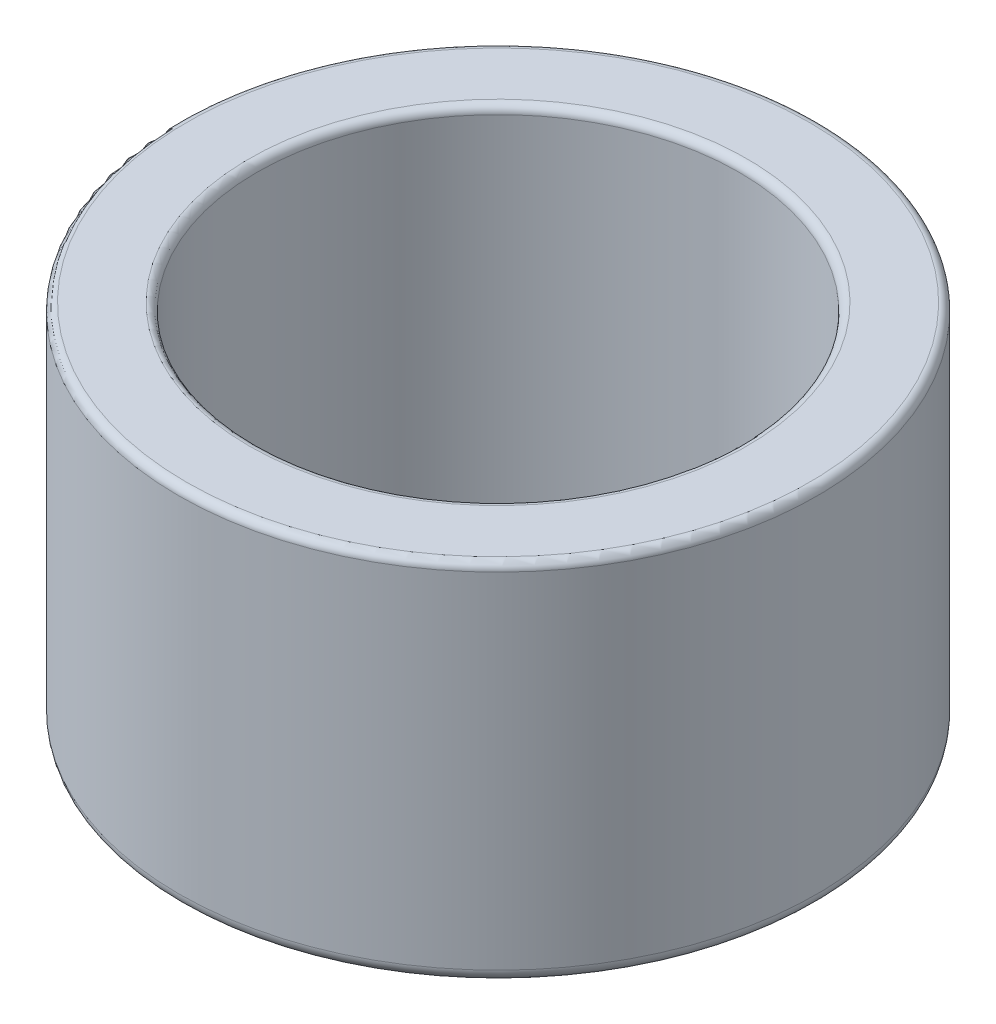
ISO-10303-21;
HEADER;
FILE_DESCRIPTION(('STEP AP214'),'2;1');
FILE_NAME('part.step','',(''),(''),'','','');
FILE_SCHEMA(('AUTOMOTIVE_DESIGN { 1 0 10303 214 1 1 1 1 }'));
ENDSEC;
DATA;
#1=APPLICATION_CONTEXT('core data for automotive mechanical design processes');
#2=APPLICATION_PROTOCOL_DEFINITION('international standard','automotive_design',2000,#1);
#3=PRODUCT_CONTEXT('',#1,'mechanical');
#4=PRODUCT('Part','Part','',(#3));
#5=PRODUCT_RELATED_PRODUCT_CATEGORY('part','',(#4));
#6=PRODUCT_DEFINITION_FORMATION('','',#4);
#7=PRODUCT_DEFINITION_CONTEXT('part definition',#1,'design');
#8=PRODUCT_DEFINITION('design','',#6,#7);
#9=PRODUCT_DEFINITION_SHAPE('','',#8);
#10=(LENGTH_UNIT() NAMED_UNIT(*) SI_UNIT(.MILLI.,.METRE.));
#11=(NAMED_UNIT(*) PLANE_ANGLE_UNIT() SI_UNIT($,.RADIAN.));
#12=(NAMED_UNIT(*) SI_UNIT($,.STERADIAN.) SOLID_ANGLE_UNIT());
#13=UNCERTAINTY_MEASURE_WITH_UNIT(LENGTH_MEASURE(1.E-05),#10,'distance_accuracy_value','');
#14=(GEOMETRIC_REPRESENTATION_CONTEXT(3) GLOBAL_UNCERTAINTY_ASSIGNED_CONTEXT((#13)) GLOBAL_UNIT_ASSIGNED_CONTEXT((#10,
#11,#12)) REPRESENTATION_CONTEXT('',''));
#15=CARTESIAN_POINT('',(0.,0.,0.));
#16=DIRECTION('',(0.,0.,1.));
#17=DIRECTION('',(1.,0.,0.));
#18=AXIS2_PLACEMENT_3D('',#15,#16,#17);
#19=CARTESIAN_POINT('',(0.,14.,0.));
#20=DIRECTION('',(0.,1.,0.));
#21=DIRECTION('',(0.,0.,1.));
#22=AXIS2_PLACEMENT_3D('',#19,#20,#21);
#23=PLANE('',#22);
#24=CARTESIAN_POINT('',(0.,14.,0.));
#25=DIRECTION('',(0.,1.,0.));
#26=DIRECTION('',(0.,0.,1.));
#27=AXIS2_PLACEMENT_3D('',#24,#25,#26);
#28=CIRCLE('',#27,9.530985);
#29=CARTESIAN_POINT('',(0.,14.,9.530985));
#30=VERTEX_POINT('',#29);
#31=EDGE_CURVE('E53',#30,#30,#28,.F.);
#32=ORIENTED_EDGE('',*,*,#31,.T.);
#33=EDGE_LOOP('',(#32));
#34=FACE_BOUND('',#33,.T.);
#35=CARTESIAN_POINT('',(0.,14.,0.));
#36=DIRECTION('',(0.,1.,0.));
#37=DIRECTION('',(0.,0.,1.));
#38=AXIS2_PLACEMENT_3D('',#35,#36,#37);
#39=CIRCLE('',#38,11.930985);
#40=CARTESIAN_POINT('',(0.,14.,11.930985));
#41=VERTEX_POINT('',#40);
#42=EDGE_CURVE('E62',#41,#41,#39,.T.);
#43=ORIENTED_EDGE('',*,*,#42,.T.);
#44=EDGE_LOOP('',(#43));
#45=FACE_BOUND('',#44,.T.);
#46=ADVANCED_FACE('F33',(#34,#45),#23,.T.);
#47=CARTESIAN_POINT('',(0.,0.,0.));
#48=DIRECTION('',(0.,1.,0.));
#49=DIRECTION('',(0.,0.,1.));
#50=AXIS2_PLACEMENT_3D('',#47,#48,#49);
#51=PLANE('',#50);
#52=CARTESIAN_POINT('',(0.,0.,0.));
#53=DIRECTION('',(0.,1.,0.));
#54=DIRECTION('',(0.,0.,1.));
#55=AXIS2_PLACEMENT_3D('',#52,#53,#54);
#56=CIRCLE('',#55,9.730985);
#57=CARTESIAN_POINT('',(0.,0.,9.730985));
#58=VERTEX_POINT('',#57);
#59=EDGE_CURVE('E40',#58,#58,#56,.T.);
#60=ORIENTED_EDGE('',*,*,#59,.T.);
#61=EDGE_LOOP('',(#60));
#62=FACE_BOUND('',#61,.T.);
#63=CARTESIAN_POINT('',(0.,0.,0.));
#64=DIRECTION('',(0.,1.,0.));
#65=DIRECTION('',(0.,0.,1.));
#66=AXIS2_PLACEMENT_3D('',#63,#64,#65);
#67=CIRCLE('',#66,11.730985);
#68=CARTESIAN_POINT('',(0.,0.,11.730985));
#69=VERTEX_POINT('',#68);
#70=EDGE_CURVE('E44',#69,#69,#67,.F.);
#71=ORIENTED_EDGE('',*,*,#70,.T.);
#72=EDGE_LOOP('',(#71));
#73=FACE_BOUND('',#72,.T.);
#74=ADVANCED_FACE('F85',(#62,#73),#51,.F.);
#75=CARTESIAN_POINT('',(0.,14.,0.));
#76=DIRECTION('',(0.,-1.,0.));
#77=DIRECTION('',(0.,0.,-1.));
#78=AXIS2_PLACEMENT_3D('',#75,#76,#77);
#79=CYLINDRICAL_SURFACE('',#78,12.230985);
#80=CARTESIAN_POINT('',(0.,0.5,0.));
#81=DIRECTION('',(0.,1.,0.));
#82=DIRECTION('',(0.,0.,1.));
#83=AXIS2_PLACEMENT_3D('',#80,#81,#82);
#84=CIRCLE('',#83,12.230985);
#85=CARTESIAN_POINT('',(0.,0.5,12.230985));
#86=VERTEX_POINT('',#85);
#87=EDGE_CURVE('E48',#86,#86,#84,.T.);
#88=ORIENTED_EDGE('',*,*,#87,.T.);
#89=EDGE_LOOP('',(#88));
#90=FACE_BOUND('',#89,.T.);
#91=CARTESIAN_POINT('',(0.,13.7,0.));
#92=DIRECTION('',(0.,1.,0.));
#93=DIRECTION('',(0.,0.,1.));
#94=AXIS2_PLACEMENT_3D('',#91,#92,#93);
#95=CIRCLE('',#94,12.230985);
#96=CARTESIAN_POINT('',(0.,13.7,12.230985));
#97=VERTEX_POINT('',#96);
#98=EDGE_CURVE('E59',#97,#97,#95,.F.);
#99=ORIENTED_EDGE('',*,*,#98,.T.);
#100=EDGE_LOOP('',(#99));
#101=FACE_BOUND('',#100,.T.);
#102=ADVANCED_FACE('F80',(#90,#101),#79,.T.);
#103=CARTESIAN_POINT('',(0.,14.,0.));
#104=DIRECTION('',(0.,-1.,0.));
#105=DIRECTION('',(0.,0.,-1.));
#106=AXIS2_PLACEMENT_3D('',#103,#104,#105);
#107=CYLINDRICAL_SURFACE('',#106,9.230985);
#108=CARTESIAN_POINT('',(0.,0.5,0.));
#109=DIRECTION('',(0.,1.,0.));
#110=DIRECTION('',(0.,0.,1.));
#111=AXIS2_PLACEMENT_3D('',#108,#109,#110);
#112=CIRCLE('',#111,9.230985);
#113=CARTESIAN_POINT('',(0.,0.5,9.230985));
#114=VERTEX_POINT('',#113);
#115=EDGE_CURVE('E10',#114,#114,#112,.F.);
#116=ORIENTED_EDGE('',*,*,#115,.T.);
#117=EDGE_LOOP('',(#116));
#118=FACE_BOUND('',#117,.T.);
#119=CARTESIAN_POINT('',(0.,13.7,0.));
#120=DIRECTION('',(0.,1.,0.));
#121=DIRECTION('',(0.,0.,1.));
#122=AXIS2_PLACEMENT_3D('',#119,#120,#121);
#123=CIRCLE('',#122,9.230985);
#124=CARTESIAN_POINT('',(0.,13.7,9.230985));
#125=VERTEX_POINT('',#124);
#126=EDGE_CURVE('E56',#125,#125,#123,.T.);
#127=ORIENTED_EDGE('',*,*,#126,.T.);
#128=EDGE_LOOP('',(#127));
#129=FACE_BOUND('',#128,.T.);
#130=ADVANCED_FACE('F70',(#118,#129),#107,.F.);
#131=CARTESIAN_POINT('',(0.,13.7,0.));
#132=DIRECTION('',(0.,1.,0.));
#133=DIRECTION('',(0.,0.,1.));
#134=AXIS2_PLACEMENT_3D('',#131,#132,#133);
#135=TOROIDAL_SURFACE('',#134,11.930985,0.3);
#136=ORIENTED_EDGE('',*,*,#98,.F.);
#137=EDGE_LOOP('',(#136));
#138=FACE_BOUND('',#137,.T.);
#139=ORIENTED_EDGE('',*,*,#42,.F.);
#140=EDGE_LOOP('',(#139));
#141=FACE_BOUND('',#140,.T.);
#142=ADVANCED_FACE('F67',(#138,#141),#135,.T.);
#143=CARTESIAN_POINT('',(0.,13.7,0.));
#144=DIRECTION('',(0.,1.,0.));
#145=DIRECTION('',(0.,0.,1.));
#146=AXIS2_PLACEMENT_3D('',#143,#144,#145);
#147=TOROIDAL_SURFACE('',#146,9.530985,0.3);
#148=ORIENTED_EDGE('',*,*,#31,.F.);
#149=EDGE_LOOP('',(#148));
#150=FACE_BOUND('',#149,.T.);
#151=ORIENTED_EDGE('',*,*,#126,.F.);
#152=EDGE_LOOP('',(#151));
#153=FACE_BOUND('',#152,.T.);
#154=ADVANCED_FACE('F69',(#150,#153),#147,.T.);
#155=CARTESIAN_POINT('',(0.,0.5,0.));
#156=DIRECTION('',(0.,1.,0.));
#157=DIRECTION('',(0.,0.,1.));
#158=AXIS2_PLACEMENT_3D('',#155,#156,#157);
#159=TOROIDAL_SURFACE('',#158,11.730985,0.5);
#160=ORIENTED_EDGE('',*,*,#70,.F.);
#161=EDGE_LOOP('',(#160));
#162=FACE_BOUND('',#161,.T.);
#163=ORIENTED_EDGE('',*,*,#87,.F.);
#164=EDGE_LOOP('',(#163));
#165=FACE_BOUND('',#164,.T.);
#166=ADVANCED_FACE('F77',(#162,#165),#159,.T.);
#167=CARTESIAN_POINT('',(0.,0.5,0.));
#168=DIRECTION('',(0.,1.,0.));
#169=DIRECTION('',(0.,0.,1.));
#170=AXIS2_PLACEMENT_3D('',#167,#168,#169);
#171=TOROIDAL_SURFACE('',#170,9.730985,0.5);
#172=ORIENTED_EDGE('',*,*,#115,.F.);
#173=EDGE_LOOP('',(#172));
#174=FACE_BOUND('',#173,.T.);
#175=ORIENTED_EDGE('',*,*,#59,.F.);
#176=EDGE_LOOP('',(#175));
#177=FACE_BOUND('',#176,.T.);
#178=ADVANCED_FACE('F35',(#174,#177),#171,.T.);
#179=CLOSED_SHELL('',(#46,#74,#102,#130,#142,#154,#166,#178));
#180=MANIFOLD_SOLID_BREP('B2',#179);
#181=ADVANCED_BREP_SHAPE_REPRESENTATION('',(#18,#180),#14);
#182=SHAPE_DEFINITION_REPRESENTATION(#9,#181);
ENDSEC;
END-ISO-10303-21;
